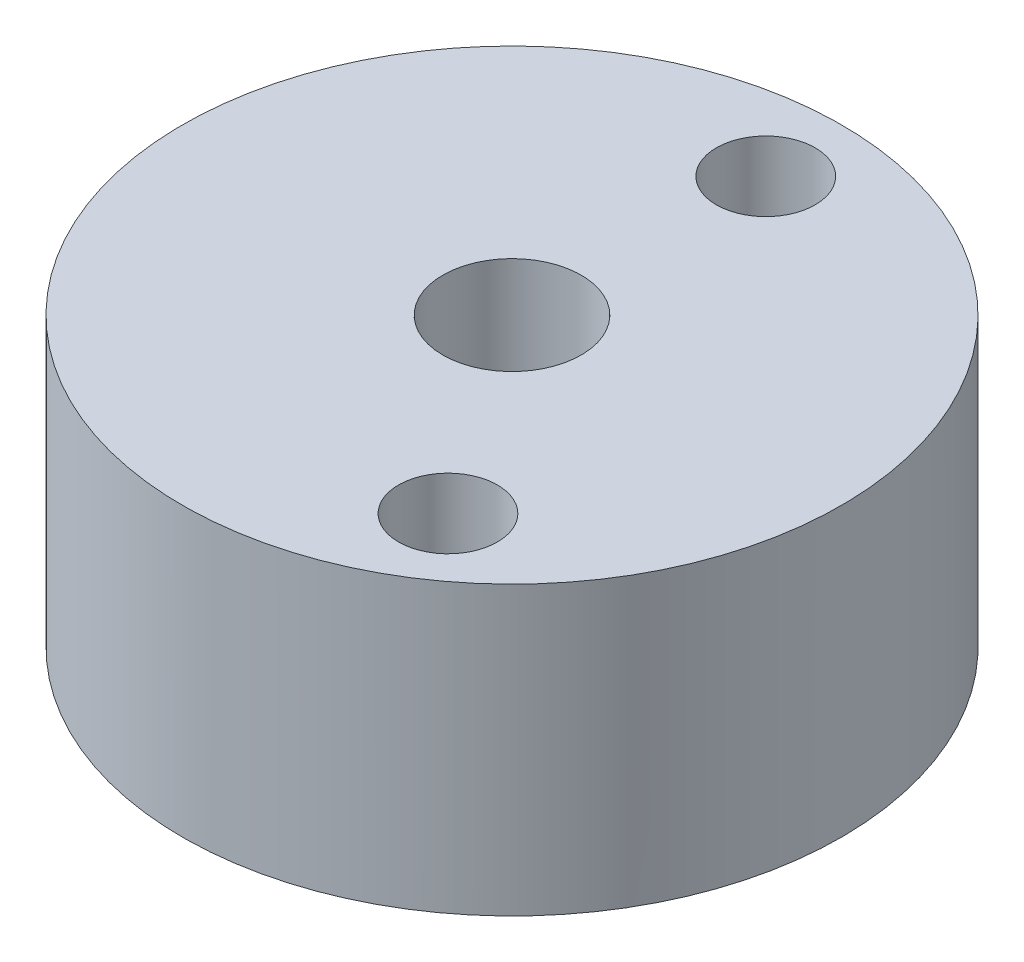
ISO-10303-21;
HEADER;
FILE_DESCRIPTION(('STEP AP214'),'2;1');
FILE_NAME('part.step','',(''),(''),'','','');
FILE_SCHEMA(('AUTOMOTIVE_DESIGN { 1 0 10303 214 1 1 1 1 }'));
ENDSEC;
DATA;
#1=APPLICATION_CONTEXT('core data for automotive mechanical design processes');
#2=APPLICATION_PROTOCOL_DEFINITION('international standard','automotive_design',2000,#1);
#3=PRODUCT_CONTEXT('',#1,'mechanical');
#4=PRODUCT('Part','Part','',(#3));
#5=PRODUCT_RELATED_PRODUCT_CATEGORY('part','',(#4));
#6=PRODUCT_DEFINITION_FORMATION('','',#4);
#7=PRODUCT_DEFINITION_CONTEXT('part definition',#1,'design');
#8=PRODUCT_DEFINITION('design','',#6,#7);
#9=PRODUCT_DEFINITION_SHAPE('','',#8);
#10=(LENGTH_UNIT() NAMED_UNIT(*) SI_UNIT(.MILLI.,.METRE.));
#11=(NAMED_UNIT(*) PLANE_ANGLE_UNIT() SI_UNIT($,.RADIAN.));
#12=(NAMED_UNIT(*) SI_UNIT($,.STERADIAN.) SOLID_ANGLE_UNIT());
#13=UNCERTAINTY_MEASURE_WITH_UNIT(LENGTH_MEASURE(1.E-05),#10,'distance_accuracy_value','');
#14=(GEOMETRIC_REPRESENTATION_CONTEXT(3) GLOBAL_UNCERTAINTY_ASSIGNED_CONTEXT((#13)) GLOBAL_UNIT_ASSIGNED_CONTEXT((#10,
#11,#12)) REPRESENTATION_CONTEXT('',''));
#15=CARTESIAN_POINT('',(0.,0.,0.));
#16=DIRECTION('',(0.,0.,1.));
#17=DIRECTION('',(1.,0.,0.));
#18=AXIS2_PLACEMENT_3D('',#15,#16,#17);
#19=CARTESIAN_POINT('',(0.,-2.,0.));
#20=DIRECTION('',(0.,1.,0.));
#21=DIRECTION('',(0.,0.,1.));
#22=AXIS2_PLACEMENT_3D('',#19,#20,#21);
#23=CYLINDRICAL_SURFACE('',#22,10.);
#24=CARTESIAN_POINT('',(0.,-0.221838608355118,0.));
#25=DIRECTION('',(0.,-1.,0.));
#26=DIRECTION('',(0.,0.,-1.));
#27=AXIS2_PLACEMENT_3D('',#24,#25,#26);
#28=CIRCLE('',#27,10.);
#29=CARTESIAN_POINT('',(0.,-0.221838608355118,-10.));
#30=VERTEX_POINT('',#29);
#31=EDGE_CURVE('E43',#30,#30,#28,.T.);
#32=ORIENTED_EDGE('',*,*,#31,.F.);
#33=EDGE_LOOP('',(#32));
#34=FACE_BOUND('',#33,.T.);
#35=CARTESIAN_POINT('',(-2.12713563874592E-12,8.50000000001106,-1.48534106308155E-12));
#36=DIRECTION('',(0.,1.,0.));
#37=DIRECTION('',(-0.996096260176884,0.,0.0882736679968943));
#38=AXIS2_PLACEMENT_3D('',#35,#36,#37);
#39=CIRCLE('',#38,10.);
#40=CARTESIAN_POINT('',(-9.96096260177097,8.50000000001107,0.882736679967458));
#41=VERTEX_POINT('',#40);
#42=EDGE_CURVE('E10',#41,#41,#39,.T.);
#43=ORIENTED_EDGE('',*,*,#42,.F.);
#44=EDGE_LOOP('',(#43));
#45=FACE_BOUND('',#44,.T.);
#46=ADVANCED_FACE('F31',(#34,#45),#23,.T.);
#47=CARTESIAN_POINT('',(-2.12713563874592E-12,8.50000000001106,-1.48534106308155E-12));
#48=DIRECTION('',(0.,1.,0.));
#49=DIRECTION('',(-0.996096260176884,0.,0.0882736679968943));
#50=AXIS2_PLACEMENT_3D('',#47,#48,#49);
#51=PLANE('',#50);
#52=CARTESIAN_POINT('',(0.203603830246942,8.50000000001105,-7.49723585599191));
#53=DIRECTION('',(0.,1.,0.));
#54=DIRECTION('',(0.,0.,1.));
#55=AXIS2_PLACEMENT_3D('',#52,#53,#54);
#56=CIRCLE('',#55,1.5);
#57=CARTESIAN_POINT('',(0.203603830246942,8.50000000001105,-5.99723585599191));
#58=VERTEX_POINT('',#57);
#59=EDGE_CURVE('E65',#58,#58,#56,.T.);
#60=ORIENTED_EDGE('',*,*,#59,.F.);
#61=EDGE_LOOP('',(#60));
#62=FACE_BOUND('',#61,.T.);
#63=CARTESIAN_POINT('',(4.24204571031047,8.50000000001107,6.18506654705893));
#64=DIRECTION('',(0.,1.,0.));
#65=DIRECTION('',(0.,0.,1.));
#66=AXIS2_PLACEMENT_3D('',#63,#64,#65);
#67=CIRCLE('',#66,1.5);
#68=CARTESIAN_POINT('',(4.24204571031047,8.50000000001107,7.68506654705893));
#69=VERTEX_POINT('',#68);
#70=EDGE_CURVE('E113',#69,#69,#67,.T.);
#71=ORIENTED_EDGE('',*,*,#70,.F.);
#72=EDGE_LOOP('',(#71));
#73=FACE_BOUND('',#72,.T.);
#74=CARTESIAN_POINT('',(0.,8.50000000001106,0.));
#75=DIRECTION('',(0.,1.,0.));
#76=DIRECTION('',(0.,0.,1.));
#77=AXIS2_PLACEMENT_3D('',#74,#75,#76);
#78=CIRCLE('',#77,2.1);
#79=CARTESIAN_POINT('',(0.,8.50000000001106,2.09999999999999));
#80=VERTEX_POINT('',#79);
#81=EDGE_CURVE('E58',#80,#80,#78,.T.);
#82=ORIENTED_EDGE('',*,*,#81,.F.);
#83=EDGE_LOOP('',(#82));
#84=FACE_BOUND('',#83,.T.);
#85=ORIENTED_EDGE('',*,*,#42,.T.);
#86=EDGE_LOOP('',(#85));
#87=FACE_BOUND('',#86,.T.);
#88=ADVANCED_FACE('F91',(#62,#73,#84,#87),#51,.T.);
#89=CARTESIAN_POINT('',(0.,-225.5,0.));
#90=DIRECTION('',(0.,1.,0.));
#91=DIRECTION('',(0.,0.,-1.));
#92=AXIS2_PLACEMENT_3D('',#89,#90,#91);
#93=SPHERICAL_SURFACE('',#92,225.5);
#94=CARTESIAN_POINT('',(-0.857730782344653,-0.164054656251117,-8.55722115783185));
#95=CARTESIAN_POINT('',(-0.917292540269054,-0.162016438490826,-8.49757827898675));
#96=CARTESIAN_POINT('',(-0.971856165304111,-0.159813982452262,-8.43286250755019));
#97=CARTESIAN_POINT('',(-1.0693803038765,-0.155143710099282,-8.29513779461679));
#98=CARTESIAN_POINT('',(-1.11232668567265,-0.152675575655666,-8.22211890475231));
#99=CARTESIAN_POINT('',(-1.18532546009791,-0.147546745418643,-8.06994035087788));
#100=CARTESIAN_POINT('',(-1.21538424557439,-0.144886145864174,-7.99078375452071));
#101=CARTESIAN_POINT('',(-1.26177375573629,-0.139447772175952,-7.82857263355433));
#102=CARTESIAN_POINT('',(-1.2781078948629,-0.1366700273665,-7.74551908386788));
#103=CARTESIAN_POINT('',(-1.29660477709571,-0.131074353072665,-7.57781602179673));
#104=CARTESIAN_POINT('',(-1.29876189883629,-0.128256408092184,-7.4931658896872));
#105=CARTESIAN_POINT('',(-1.28882772747847,-0.12266128957848,-7.32470114810684));
#106=CARTESIAN_POINT('',(-1.27673585644343,-0.119884117703633,-7.24088657266509));
#107=CARTESIAN_POINT('',(-1.23864320068276,-0.114449254342751,-7.07646854815323));
#108=CARTESIAN_POINT('',(-1.21264126123904,-0.111791572795839,-6.99586536626783));
#109=CARTESIAN_POINT('',(-1.1474636932675,-0.106671423860141,-6.84016735687809));
#110=CARTESIAN_POINT('',(-1.10828810279884,-0.104208955907402,-6.7650725134607));
#111=CARTESIAN_POINT('',(-1.01788445357746,-0.0995497963614989,-6.6225436738363));
#112=CARTESIAN_POINT('',(-0.966659409060854,-0.0973530385072821,-6.55510776795041));
#113=CARTESIAN_POINT('',(-0.853603803148866,-0.0932870521992318,-6.42979346473748));
#114=CARTESIAN_POINT('',(-0.791773287243297,-0.091417822340609,-6.37191502641789));
#115=CARTESIAN_POINT('',(-0.659294318542392,-0.0880609201160911,-6.26738938015906));
#116=CARTESIAN_POINT('',(-0.588650241968657,-0.0865730595000558,-6.22073663173359));
#117=CARTESIAN_POINT('',(-0.440525179649641,-0.0840200368265832,-6.1399538362168));
#118=CARTESIAN_POINT('',(-0.363044207063051,-0.0829548739556189,-6.10582376502425));
#119=CARTESIAN_POINT('',(-0.203488330757221,-0.081278027555468,-6.05107327338851));
#120=CARTESIAN_POINT('',(-0.121415843032902,-0.0806661079050714,-6.03044581928517));
#121=CARTESIAN_POINT('',(0.0450290907211213,-0.0799122611396667,-6.00325970066263));
#122=CARTESIAN_POINT('',(0.12940153078388,-0.0797703328054403,-5.99670099964729));
#123=CARTESIAN_POINT('',(0.298022688542473,-0.0799604777801559,-5.99783883120088));
#124=CARTESIAN_POINT('',(0.382271437084708,-0.0802924001356181,-6.00553082419273));
#125=CARTESIAN_POINT('',(0.548280603549603,-0.0814205255556437,-6.03494179168839));
#126=CARTESIAN_POINT('',(0.630041022219828,-0.0822167284807227,-6.05666076197804));
#127=CARTESIAN_POINT('',(0.788755355327669,-0.0842507853643698,-6.11350780276144));
#128=CARTESIAN_POINT('',(0.865709158326011,-0.0854886495581977,-6.14863618401231));
#129=CARTESIAN_POINT('',(1.01262618364423,-0.0883708301933355,-6.23130242533269));
#130=CARTESIAN_POINT('',(1.0825893957434,-0.0900151472288937,-6.27884030354533));
#131=CARTESIAN_POINT('',(1.2135665040855,-0.0936641748530052,-6.38499318039843));
#132=CARTESIAN_POINT('',(1.27457721686796,-0.0956690130796852,-6.44361210252489));
#133=CARTESIAN_POINT('',(1.38589206029067,-0.0999817609518549,-6.57025059027676));
#134=CARTESIAN_POINT('',(1.4361961606291,-0.102289671455068,-6.63827018250701));
#135=CARTESIAN_POINT('',(1.5246982094878,-0.107144385097675,-6.78181777985495));
#136=CARTESIAN_POINT('',(1.5628897157896,-0.109691314431863,-6.85734975255801));
#137=CARTESIAN_POINT('',(1.62604964185985,-0.114950763941259,-7.01374812804093));
#138=CARTESIAN_POINT('',(1.65101802571457,-0.117663284566188,-7.09461454530835));
#139=CARTESIAN_POINT('',(1.68703419991571,-0.123178312830712,-7.25942751668639));
#140=CARTESIAN_POINT('',(1.69807537743414,-0.125980862570237,-7.34337551452079));
#141=CARTESIAN_POINT('',(1.70590282483932,-0.131595204118439,-7.511933271645));
#142=CARTESIAN_POINT('',(1.70268906524318,-0.134406995946219,-7.59654303230315));
#143=CARTESIAN_POINT('',(1.68209506332463,-0.13996061949027,-7.76404119937927));
#144=CARTESIAN_POINT('',(1.66471183220181,-0.142702436320698,-7.84692923884746));
#145=CARTESIAN_POINT('',(1.61626682492149,-0.148037619132213,-8.00861172640902));
#146=CARTESIAN_POINT('',(1.58520506670138,-0.150630985307965,-8.08740617987039));
#147=CARTESIAN_POINT('',(1.51028799528099,-0.15559519669837,-8.23865165411149));
#148=CARTESIAN_POINT('',(1.46643455543054,-0.157966074429443,-8.31110360173663));
#149=CARTESIAN_POINT('',(1.36717484474569,-0.162418303484263,-8.44761712829039));
#150=CARTESIAN_POINT('',(1.31176857692159,-0.164499654883452,-8.51167870940527));
#151=CARTESIAN_POINT('',(1.19100165216183,-0.168312716622378,-8.62956209181377));
#152=CARTESIAN_POINT('',(1.12564539405957,-0.170044580685494,-8.68338839453099));
#153=CARTESIAN_POINT('',(0.986814931111087,-0.17311048557307,-8.77930400240237));
#154=CARTESIAN_POINT('',(0.91334073402944,-0.174444526778031,-8.8213933187825));
#155=CARTESIAN_POINT('',(0.760401411055369,-0.176676161878639,-8.89261703076624));
#156=CARTESIAN_POINT('',(0.680939424596717,-0.177573982673297,-8.9217581606625));
#157=CARTESIAN_POINT('',(0.518250534291672,-0.178908584793455,-8.96628643601859));
#158=CARTESIAN_POINT('',(0.435023788255372,-0.179345385425222,-8.98167415742953));
#159=CARTESIAN_POINT('',(0.267210341853898,-0.179745469278993,-8.99825554012977));
#160=CARTESIAN_POINT('',(0.182624353472855,-0.179708992820331,-8.99945640459031));
#161=CARTESIAN_POINT('',(0.0144289738270306,-0.179164014817502,-8.9876454476032));
#162=CARTESIAN_POINT('',(-0.0691801703257912,-0.178655396346129,-8.97463010533364));
#163=CARTESIAN_POINT('',(-0.233049623827707,-0.177180417597574,-8.93475129676532));
#164=CARTESIAN_POINT('',(-0.313308622385562,-0.176213879946345,-8.90788246398928));
#165=CARTESIAN_POINT('',(-0.468102562476847,-0.173851084651794,-8.84107382212781));
#166=CARTESIAN_POINT('',(-0.542644272208071,-0.172455345228294,-8.80114977229509));
#167=CARTESIAN_POINT('',(-0.657342733143588,-0.169874017110597,-8.72668294170552));
#168=CARTESIAN_POINT('',(-0.699894392255585,-0.168806558617175,-8.69575590509198));
#169=CARTESIAN_POINT('',(-0.781521847282722,-0.166532230685204,-8.62961686961997));
#170=CARTESIAN_POINT('',(-0.820597643280701,-0.165325361249978,-8.59440487086362));
#171=CARTESIAN_POINT('',(-0.857730782344653,-0.164054656251117,-8.55722115783185));
#172=B_SPLINE_CURVE_WITH_KNOTS('',3,(#94,#95,#96,#97,#98,#99,#100,#101,#102,#103,#104,#105,#106,
#107,#108,#109,#110,#111,#112,#113,#114,#115,#116,#117,#118,#119,#120,#121,#122,#123,#124,#125,
#126,#127,#128,#129,#130,#131,#132,#133,#134,#135,#136,#137,#138,#139,#140,#141,#142,#143,#144,
#145,#146,#147,#148,#149,#150,#151,#152,#153,#154,#155,#156,#157,#158,#159,#160,#161,#162,#163,
#164,#165,#166,#167,#168,#169,#170,#171),.UNSPECIFIED.,.T.,.F.,(4,2,2,2,2,2,2,2,2,2,2,2,2,2,2,2,
2,2,2,2,2,2,2,2,2,2,2,2,2,2,2,2,2,2,2,2,2,2,4),(0.,0.252753215583285,0.505812522944816,
0.758746155473016,1.01161684408872,1.26458779306518,1.51756900285203,1.77057121665632,
2.02357269953422,2.27651095990275,2.52944813537586,2.78226021540127,3.03507180886035,
3.28775160499033,3.5404307456358,3.79302940885267,4.04562799618102,4.29823243772456,
4.55083724858688,4.80353166780447,5.0562268021871,5.30905611078801,5.56188610606466,
5.81483610334709,6.06778662379562,6.32079051351159,6.57379407145063,6.82676059544651,
7.07972705352714,7.332581999618,7.58543670386212,7.83815974515345,8.09087220267301,
8.34345634358297,8.59610305431031,8.84884770732958,9.10128838581547,9.25886467056361,
9.41644095155631),.UNSPECIFIED.);
#173=CARTESIAN_POINT('',(-0.857730782344653,-0.164054656251117,-8.55722115783185));
#174=VERTEX_POINT('',#173);
#175=EDGE_CURVE('E34',#174,#174,#172,.T.);
#176=ORIENTED_EDGE('',*,*,#175,.T.);
#177=EDGE_LOOP('',(#176));
#178=FACE_BOUND('',#177,.T.);
#179=CARTESIAN_POINT('',(3.18119645533943,-0.0806836508909788,5.1245944330284));
#180=CARTESIAN_POINT('',(3.12164629373225,-0.0811978578660141,5.18417080138157));
#181=CARTESIAN_POINT('',(3.06708431352565,-0.0819441903952909,5.2488180716085));
#182=CARTESIAN_POINT('',(2.96954282776958,-0.0838831927094567,5.38640331624356));
#183=CARTESIAN_POINT('',(2.92657738612637,-0.0850764003019833,5.45935120638551));
#184=CARTESIAN_POINT('',(2.85352139167702,-0.0878734066579839,5.61138826286734));
#185=CARTESIAN_POINT('',(2.82342446840813,-0.089477001632307,5.6904743675663));
#186=CARTESIAN_POINT('',(2.77693933369499,-0.0930492909595899,5.8525462662035));
#187=CARTESIAN_POINT('',(2.76054772467842,-0.0950178946782841,5.93553108825167));
#188=CARTESIAN_POINT('',(2.74191505387607,-0.0992654621157774,6.10310443140893));
#189=CARTESIAN_POINT('',(2.73968028594706,-0.101544563415887,6.18769364904167));
#190=CARTESIAN_POINT('',(2.74943841365881,-0.106347883774409,6.35604359364992));
#191=CARTESIAN_POINT('',(2.76143191063848,-0.1088721131887,6.439804285458));
#192=CARTESIAN_POINT('',(2.79931409393715,-0.114095375759013,6.60416230465485));
#193=CARTESIAN_POINT('',(2.82520996008749,-0.11679449860425,6.68475797437752));
#194=CARTESIAN_POINT('',(2.8901647533139,-0.122289797512017,6.84045424913518));
#195=CARTESIAN_POINT('',(2.92922368605224,-0.125085973616295,6.91555485180638));
#196=CARTESIAN_POINT('',(3.01941318208009,-0.130697147672134,7.05815867785731));
#197=CARTESIAN_POINT('',(3.0705483173333,-0.133512152358893,7.12565900950061));
#198=CARTESIAN_POINT('',(3.18343115253372,-0.139080027149939,7.25111323680797));
#199=CARTESIAN_POINT('',(3.24517884241565,-0.141832897313154,7.30906714152604));
#200=CARTESIAN_POINT('',(3.37753882283861,-0.147198487132627,7.41378517571459));
#201=CARTESIAN_POINT('',(3.44815159185686,-0.149811199213225,7.46054870080758));
#202=CARTESIAN_POINT('',(3.59623542918967,-0.154822063071276,7.54155157430747));
#203=CARTESIAN_POINT('',(3.67370649699501,-0.15722021486466,7.57579092364428));
#204=CARTESIAN_POINT('',(3.83328376865104,-0.161733070945373,7.63076127447799));
#205=CARTESIAN_POINT('',(3.91538860235036,-0.163847858402672,7.65149624655909));
#206=CARTESIAN_POINT('',(4.08192248798443,-0.16773461983588,7.67888091013993));
#207=CARTESIAN_POINT('',(4.16635153289233,-0.169506594848092,7.6855306442191));
#208=CARTESIAN_POINT('',(4.3350909470028,-0.172656430276719,7.68455227324437));
#209=CARTESIAN_POINT('',(4.41940135484977,-0.174034492198293,7.67693148335797));
#210=CARTESIAN_POINT('',(4.58555119644232,-0.176358438797856,7.64763957466376));
#211=CARTESIAN_POINT('',(4.66739063716857,-0.17730432469688,7.62596849555292));
#212=CARTESIAN_POINT('',(4.82623150295673,-0.178736577980883,7.5692040192056));
#213=CARTESIAN_POINT('',(4.9032353575526,-0.179223177876494,7.53411742614283));
#214=CARTESIAN_POINT('',(5.0502625966431,-0.179723815128036,7.45151646879464));
#215=CARTESIAN_POINT('',(5.12028599537531,-0.17973785344784,7.404002129858));
#216=CARTESIAN_POINT('',(5.25134509093775,-0.179293031520834,7.29791011567521));
#217=CARTESIAN_POINT('',(5.31238328183464,-0.178834302786156,7.23933552082056));
#218=CARTESIAN_POINT('',(5.42376351744836,-0.177457222053985,7.11277804026445));
#219=CARTESIAN_POINT('',(5.47410556340956,-0.176538870109964,7.04479515565753));
#220=CARTESIAN_POINT('',(5.56267003395133,-0.174268616644503,6.90134666110745));
#221=CARTESIAN_POINT('',(5.60089158341831,-0.172916683832199,6.8258805113802));
#222=CARTESIAN_POINT('',(5.66412879545714,-0.169817765041191,6.66961213823164));
#223=CARTESIAN_POINT('',(5.6891444368172,-0.168070778427945,6.58880990623957));
#224=CARTESIAN_POINT('',(5.72527118846856,-0.164230665435793,6.42412957912724));
#225=CARTESIAN_POINT('',(5.73637686589195,-0.162137404172202,6.34025029534811));
#226=CARTESIAN_POINT('',(5.74435473476134,-0.157664706077801,6.17182515120902));
#227=CARTESIAN_POINT('',(5.74122687953286,-0.15528526830859,6.08727928866413));
#228=CARTESIAN_POINT('',(5.72082433874082,-0.150306414510124,5.91987247591275));
#229=CARTESIAN_POINT('',(5.70354204089885,-0.14770688078763,5.83701245693526));
#230=CARTESIAN_POINT('',(5.65531387386837,-0.142362734015669,5.67537411098975));
#231=CARTESIAN_POINT('',(5.62436798153832,-0.139618120720492,5.59659579093502));
#232=CARTESIAN_POINT('',(5.54967487224049,-0.134060412838976,5.44531996830839));
#233=CARTESIAN_POINT('',(5.50592191210658,-0.131247288049531,5.37282530250595));
#234=CARTESIAN_POINT('',(5.40686181578189,-0.125633573725362,5.23621333741034));
#235=CARTESIAN_POINT('',(5.35155464208274,-0.122832984231361,5.17209606531374));
#236=CARTESIAN_POINT('',(5.23094516541751,-0.117323370221321,5.05404956567462));
#237=CARTESIAN_POINT('',(5.16564124090194,-0.114614360647435,5.00012199415605));
#238=CARTESIAN_POINT('',(5.02689752511505,-0.109365304775474,4.90400062390764));
#239=CARTESIAN_POINT('',(4.95345772212313,-0.106825258720818,4.86180684208191));
#240=CARTESIAN_POINT('',(4.80054017460897,-0.101986728900655,4.790360552816));
#241=CARTESIAN_POINT('',(4.72106348531923,-0.0996882030846647,4.76110578973974));
#242=CARTESIAN_POINT('',(4.55832047570045,-0.0953976394937492,4.71636248189845));
#243=CARTESIAN_POINT('',(4.47505431255782,-0.0934055890212925,4.70087336668398));
#244=CARTESIAN_POINT('',(4.30714389157075,-0.0897855803800815,4.6841077468002));
#245=CARTESIAN_POINT('',(4.22250044678376,-0.0881574152055017,4.6828231412506));
#246=CARTESIAN_POINT('',(4.05417009123976,-0.0853097146837082,4.6944891133757));
#247=CARTESIAN_POINT('',(3.97048342051461,-0.0840902797947871,4.70744318730964));
#248=CARTESIAN_POINT('',(3.80648110830903,-0.0820953398708594,4.74721883705748));
#249=CARTESIAN_POINT('',(3.726165277059,-0.0813198098140016,4.77403963107538));
#250=CARTESIAN_POINT('',(3.57124588027686,-0.0802355500349455,4.84077315833418));
#251=CARTESIAN_POINT('',(3.4966355404467,-0.0799262583009075,4.88067005863334));
#252=CARTESIAN_POINT('',(3.38181949295373,-0.0798080445005429,4.95511388682967));
#253=CARTESIAN_POINT('',(3.33922029264525,-0.0798547773446529,4.98603814791096));
#254=CARTESIAN_POINT('',(3.25749811346759,-0.0801320643691784,5.05218090317148));
#255=CARTESIAN_POINT('',(3.2183751323089,-0.0803626184285249,5.08739939452241));
#256=CARTESIAN_POINT('',(3.18119645533943,-0.0806836508909788,5.1245944330284));
#257=B_SPLINE_CURVE_WITH_KNOTS('',3,(#179,#180,#181,#182,#183,#184,#185,#186,#187,#188,#189,
#190,#191,#192,#193,#194,#195,#196,#197,#198,#199,#200,#201,#202,#203,#204,#205,#206,#207,#208,
#209,#210,#211,#212,#213,#214,#215,#216,#217,#218,#219,#220,#221,#222,#223,#224,#225,#226,#227,
#228,#229,#230,#231,#232,#233,#234,#235,#236,#237,#238,#239,#240,#241,#242,#243,#244,#245,#246,
#247,#248,#249,#250,#251,#252,#253,#254,#255,#256),.UNSPECIFIED.,.T.,.F.,(4,2,2,2,2,2,2,2,2,2,2,
2,2,2,2,2,2,2,2,2,2,2,2,2,2,2,2,2,2,2,2,2,2,2,2,2,2,2,4),(0.,0.25251827008623,0.505341423943484,
0.758039274291475,1.01067446179365,1.26342195811882,1.51618013686526,1.76906897746528,
2.02195792684889,2.27494277209545,2.52792737740478,2.78092564299314,3.03392388979658,
3.28684771592359,3.53977077746501,3.79256422441684,4.04535695714168,4.29802164639797,
4.55068582030015,4.80327972822915,5.05587360677166,5.30848571872864,5.56109823643898,
5.81380938725294,6.06652136675567,6.31936934441621,6.57221775031789,6.82517971702515,
7.07814250493381,7.33114636890701,7.58415059736434,7.8371107026443,8.09006032475018,
8.34286568137881,8.59573312737174,8.84858631842892,9.10113447140825,9.25878813887796,
9.41644170251318),.UNSPECIFIED.);
#258=CARTESIAN_POINT('',(3.18119645533943,-0.0806836508909788,5.1245944330284));
#259=VERTEX_POINT('',#258);
#260=EDGE_CURVE('E59',#259,#259,#257,.T.);
#261=ORIENTED_EDGE('',*,*,#260,.T.);
#262=EDGE_LOOP('',(#261));
#263=FACE_BOUND('',#262,.T.);
#264=CARTESIAN_POINT('',(0.,-0.0271634985712921,0.));
#265=DIRECTION('',(0.,-1.,0.));
#266=DIRECTION('',(0.,0.,-1.));
#267=AXIS2_PLACEMENT_3D('',#264,#265,#266);
#268=CIRCLE('',#267,3.5);
#269=CARTESIAN_POINT('',(0.,-0.0271634985712916,-3.5));
#270=VERTEX_POINT('',#269);
#271=EDGE_CURVE('E48',#270,#270,#268,.F.);
#272=ORIENTED_EDGE('',*,*,#271,.T.);
#273=EDGE_LOOP('',(#272));
#274=FACE_BOUND('',#273,.T.);
#275=ORIENTED_EDGE('',*,*,#31,.T.);
#276=EDGE_LOOP('',(#275));
#277=FACE_BOUND('',#276,.T.);
#278=ADVANCED_FACE('F66',(#178,#263,#274,#277),#93,.F.);
#279=CARTESIAN_POINT('',(0.,2.37816139164488,0.));
#280=DIRECTION('',(0.,1.,0.));
#281=DIRECTION('',(0.,0.,1.));
#282=AXIS2_PLACEMENT_3D('',#279,#280,#281);
#283=CYLINDRICAL_SURFACE('',#282,3.5);
#284=CARTESIAN_POINT('',(0.,2.37816139164488,0.));
#285=DIRECTION('',(0.,1.,0.));
#286=DIRECTION('',(0.,0.,1.));
#287=AXIS2_PLACEMENT_3D('',#284,#285,#286);
#288=CIRCLE('',#287,3.5);
#289=CARTESIAN_POINT('',(0.,2.37816139164488,3.5));
#290=VERTEX_POINT('',#289);
#291=EDGE_CURVE('E51',#290,#290,#288,.T.);
#292=ORIENTED_EDGE('',*,*,#291,.T.);
#293=EDGE_LOOP('',(#292));
#294=FACE_BOUND('',#293,.T.);
#295=ORIENTED_EDGE('',*,*,#271,.F.);
#296=EDGE_LOOP('',(#295));
#297=FACE_BOUND('',#296,.T.);
#298=ADVANCED_FACE('F82',(#294,#297),#283,.F.);
#299=CARTESIAN_POINT('',(0.,2.37816139164488,0.));
#300=DIRECTION('',(0.,1.,0.));
#301=DIRECTION('',(0.,0.,1.));
#302=AXIS2_PLACEMENT_3D('',#299,#300,#301);
#303=PLANE('',#302);
#304=CARTESIAN_POINT('',(0.,2.37816139164488,0.));
#305=DIRECTION('',(0.,1.,0.));
#306=DIRECTION('',(0.,0.,1.));
#307=AXIS2_PLACEMENT_3D('',#304,#305,#306);
#308=CIRCLE('',#307,2.1);
#309=CARTESIAN_POINT('',(0.,2.37816139164488,2.1));
#310=VERTEX_POINT('',#309);
#311=EDGE_CURVE('E56',#310,#310,#308,.T.);
#312=ORIENTED_EDGE('',*,*,#311,.T.);
#313=EDGE_LOOP('',(#312));
#314=FACE_BOUND('',#313,.T.);
#315=ORIENTED_EDGE('',*,*,#291,.F.);
#316=EDGE_LOOP('',(#315));
#317=FACE_BOUND('',#316,.T.);
#318=ADVANCED_FACE('F79',(#314,#317),#303,.F.);
#319=CARTESIAN_POINT('',(0.,-0.221838608355139,0.));
#320=DIRECTION('',(0.,1.,0.));
#321=DIRECTION('',(0.,0.,1.));
#322=AXIS2_PLACEMENT_3D('',#319,#320,#321);
#323=CYLINDRICAL_SURFACE('',#322,2.1);
#324=ORIENTED_EDGE('',*,*,#81,.T.);
#325=EDGE_LOOP('',(#324));
#326=FACE_BOUND('',#325,.T.);
#327=ORIENTED_EDGE('',*,*,#311,.F.);
#328=EDGE_LOOP('',(#327));
#329=FACE_BOUND('',#328,.T.);
#330=ADVANCED_FACE('F74',(#326,#329),#323,.F.);
#331=CARTESIAN_POINT('',(4.24204571031046,-0.22183860835513,6.18506654705895));
#332=DIRECTION('',(0.,1.,0.));
#333=DIRECTION('',(0.,0.,1.));
#334=AXIS2_PLACEMENT_3D('',#331,#332,#333);
#335=CYLINDRICAL_SURFACE('',#334,1.5);
#336=ORIENTED_EDGE('',*,*,#70,.T.);
#337=EDGE_LOOP('',(#336));
#338=FACE_BOUND('',#337,.T.);
#339=ORIENTED_EDGE('',*,*,#260,.F.);
#340=EDGE_LOOP('',(#339));
#341=FACE_BOUND('',#340,.T.);
#342=ADVANCED_FACE('F69',(#338,#341),#335,.F.);
#343=CARTESIAN_POINT('',(0.203603830246937,-0.221838608355149,-7.4972358559919));
#344=DIRECTION('',(0.,1.,0.));
#345=DIRECTION('',(0.,0.,1.));
#346=AXIS2_PLACEMENT_3D('',#343,#344,#345);
#347=CYLINDRICAL_SURFACE('',#346,1.5);
#348=ORIENTED_EDGE('',*,*,#59,.T.);
#349=EDGE_LOOP('',(#348));
#350=FACE_BOUND('',#349,.T.);
#351=ORIENTED_EDGE('',*,*,#175,.F.);
#352=EDGE_LOOP('',(#351));
#353=FACE_BOUND('',#352,.T.);
#354=ADVANCED_FACE('F73',(#350,#353),#347,.F.);
#355=CLOSED_SHELL('',(#46,#88,#278,#298,#318,#330,#342,#354));
#356=MANIFOLD_SOLID_BREP('B2',#355);
#357=ADVANCED_BREP_SHAPE_REPRESENTATION('',(#18,#356),#14);
#358=SHAPE_DEFINITION_REPRESENTATION(#9,#357);
ENDSEC;
END-ISO-10303-21;
